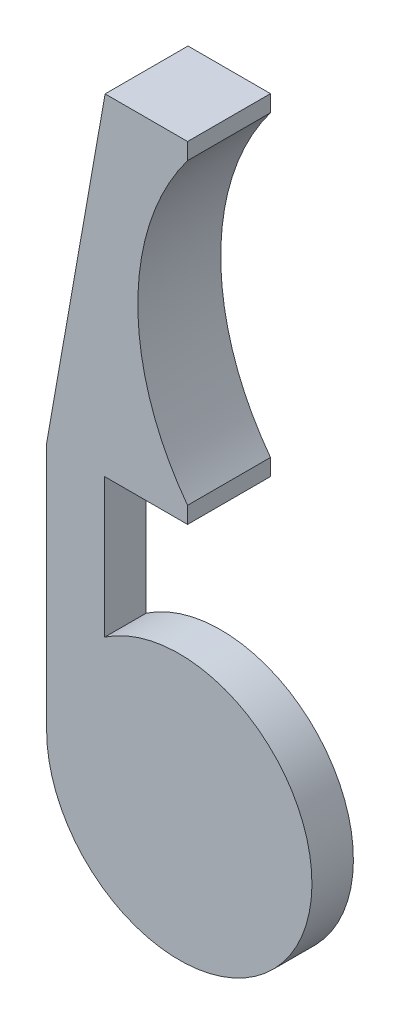
ISO-10303-21;
HEADER;
FILE_DESCRIPTION(('STEP AP214'),'2;1');
FILE_NAME('part.step','',(''),(''),'','','');
FILE_SCHEMA(('AUTOMOTIVE_DESIGN { 1 0 10303 214 1 1 1 1 }'));
ENDSEC;
DATA;
#1=APPLICATION_CONTEXT('core data for automotive mechanical design processes');
#2=APPLICATION_PROTOCOL_DEFINITION('international standard','automotive_design',2000,#1);
#3=PRODUCT_CONTEXT('',#1,'mechanical');
#4=PRODUCT('Part','Part','',(#3));
#5=PRODUCT_RELATED_PRODUCT_CATEGORY('part','',(#4));
#6=PRODUCT_DEFINITION_FORMATION('','',#4);
#7=PRODUCT_DEFINITION_CONTEXT('part definition',#1,'design');
#8=PRODUCT_DEFINITION('design','',#6,#7);
#9=PRODUCT_DEFINITION_SHAPE('','',#8);
#10=(LENGTH_UNIT() NAMED_UNIT(*) SI_UNIT(.MILLI.,.METRE.));
#11=(NAMED_UNIT(*) PLANE_ANGLE_UNIT() SI_UNIT($,.RADIAN.));
#12=(NAMED_UNIT(*) SI_UNIT($,.STERADIAN.) SOLID_ANGLE_UNIT());
#13=UNCERTAINTY_MEASURE_WITH_UNIT(LENGTH_MEASURE(1.E-05),#10,'distance_accuracy_value','');
#14=(GEOMETRIC_REPRESENTATION_CONTEXT(3) GLOBAL_UNCERTAINTY_ASSIGNED_CONTEXT((#13)) GLOBAL_UNIT_ASSIGNED_CONTEXT((#10,
#11,#12)) REPRESENTATION_CONTEXT('',''));
#15=CARTESIAN_POINT('',(0.,0.,0.));
#16=DIRECTION('',(0.,0.,1.));
#17=DIRECTION('',(1.,0.,0.));
#18=AXIS2_PLACEMENT_3D('',#15,#16,#17);
#19=CARTESIAN_POINT('',(0.,0.,6.35));
#20=DIRECTION('',(0.,0.,-1.));
#21=DIRECTION('',(-1.,0.,0.));
#22=AXIS2_PLACEMENT_3D('',#19,#20,#21);
#23=CYLINDRICAL_SURFACE('',#22,20.32);
#24=CARTESIAN_POINT('',(0.,0.,0.));
#25=DIRECTION('',(0.,0.,1.));
#26=DIRECTION('',(1.,0.,0.));
#27=AXIS2_PLACEMENT_3D('',#24,#25,#26);
#28=CIRCLE('',#27,20.32);
#29=CARTESIAN_POINT('',(-20.32,0.,0.));
#30=VERTEX_POINT('',#29);
#31=CARTESIAN_POINT('',(-11.43,16.8005208252602,0.));
#32=VERTEX_POINT('',#31);
#33=EDGE_CURVE('E201',#30,#32,#28,.T.);
#34=ORIENTED_EDGE('',*,*,#33,.T.);
#35=DIRECTION('',(0.,0.,-1.));
#36=VECTOR('',#35,1.);
#37=CARTESIAN_POINT('',(-11.43,16.8005208252602,6.35));
#38=LINE('',#37,#36);
#39=CARTESIAN_POINT('',(-11.43,16.8005208252602,6.35));
#40=VERTEX_POINT('',#39);
#41=EDGE_CURVE('E57',#32,#40,#38,.F.);
#42=ORIENTED_EDGE('',*,*,#41,.T.);
#43=CARTESIAN_POINT('',(0.,0.,6.35));
#44=DIRECTION('',(0.,0.,1.));
#45=DIRECTION('',(1.,0.,0.));
#46=AXIS2_PLACEMENT_3D('',#43,#44,#45);
#47=CIRCLE('',#46,20.32);
#48=CARTESIAN_POINT('',(-20.32,0.,6.35));
#49=VERTEX_POINT('',#48);
#50=EDGE_CURVE('E46',#49,#40,#47,.T.);
#51=ORIENTED_EDGE('',*,*,#50,.F.);
#52=DIRECTION('',(0.,0.,1.));
#53=VECTOR('',#52,1.);
#54=CARTESIAN_POINT('',(-20.32,0.,-39.1234213739034));
#55=LINE('',#54,#53);
#56=EDGE_CURVE('E174',#30,#49,#55,.T.);
#57=ORIENTED_EDGE('',*,*,#56,.F.);
#58=EDGE_LOOP('',(#34,#42,#51,#57));
#59=FACE_BOUND('',#58,.T.);
#60=ADVANCED_FACE('F39',(#59),#23,.T.);
#61=CARTESIAN_POINT('',(0.,0.,6.35));
#62=DIRECTION('',(0.,0.,1.));
#63=DIRECTION('',(1.,0.,0.));
#64=AXIS2_PLACEMENT_3D('',#61,#62,#63);
#65=PLANE('',#64);
#66=ORIENTED_EDGE('',*,*,#50,.T.);
#67=DIRECTION('',(0.,1.,0.));
#68=VECTOR('',#67,1.);
#69=CARTESIAN_POINT('',(-11.43,0.,6.35));
#70=LINE('',#69,#68);
#71=CARTESIAN_POINT('',(-11.43,38.1,6.35));
#72=VERTEX_POINT('',#71);
#73=EDGE_CURVE('E162',#40,#72,#70,.T.);
#74=ORIENTED_EDGE('',*,*,#73,.T.);
#75=DIRECTION('',(1.,0.,0.));
#76=VECTOR('',#75,1.);
#77=CARTESIAN_POINT('',(-11.43,38.1,6.35));
#78=LINE('',#77,#76);
#79=CARTESIAN_POINT('',(1.27,38.1,6.35));
#80=VERTEX_POINT('',#79);
#81=EDGE_CURVE('E147',#72,#80,#78,.T.);
#82=ORIENTED_EDGE('',*,*,#81,.T.);
#83=DIRECTION('',(0.,1.,0.));
#84=VECTOR('',#83,1.);
#85=CARTESIAN_POINT('',(1.27,38.1,6.35));
#86=LINE('',#85,#84);
#87=CARTESIAN_POINT('',(1.27000000000001,40.64,6.35));
#88=VERTEX_POINT('',#87);
#89=EDGE_CURVE('E128',#80,#88,#86,.T.);
#90=ORIENTED_EDGE('',*,*,#89,.T.);
#91=CARTESIAN_POINT('',(31.75,63.5,6.35));
#92=DIRECTION('',(0.,0.,-1.));
#93=DIRECTION('',(-1.,0.,0.));
#94=AXIS2_PLACEMENT_3D('',#91,#92,#93);
#95=CIRCLE('',#94,38.1);
#96=CARTESIAN_POINT('',(1.27,86.36,6.35));
#97=VERTEX_POINT('',#96);
#98=EDGE_CURVE('E150',#88,#97,#95,.T.);
#99=ORIENTED_EDGE('',*,*,#98,.T.);
#100=DIRECTION('',(0.,1.,0.));
#101=VECTOR('',#100,1.);
#102=CARTESIAN_POINT('',(1.27,88.9,6.35));
#103=LINE('',#102,#101);
#104=CARTESIAN_POINT('',(1.27,88.9,6.35));
#105=VERTEX_POINT('',#104);
#106=EDGE_CURVE('E153',#97,#105,#103,.T.);
#107=ORIENTED_EDGE('',*,*,#106,.T.);
#108=DIRECTION('',(-1.,0.,0.));
#109=VECTOR('',#108,1.);
#110=CARTESIAN_POINT('',(-11.3625893800101,88.9,6.35));
#111=LINE('',#110,#109);
#112=CARTESIAN_POINT('',(-11.3625893800101,88.9,6.35));
#113=VERTEX_POINT('',#112);
#114=EDGE_CURVE('E156',#105,#113,#111,.T.);
#115=ORIENTED_EDGE('',*,*,#114,.T.);
#116=DIRECTION('',(-0.173648177666927,-0.984807753012209,0.));
#117=VECTOR('',#116,1.);
#118=CARTESIAN_POINT('',(-20.32,38.1,6.35));
#119=LINE('',#118,#117);
#120=CARTESIAN_POINT('',(-20.32,38.1,6.35));
#121=VERTEX_POINT('',#120);
#122=EDGE_CURVE('E122',#113,#121,#119,.T.);
#123=ORIENTED_EDGE('',*,*,#122,.T.);
#124=DIRECTION('',(0.,-1.,0.));
#125=VECTOR('',#124,1.);
#126=CARTESIAN_POINT('',(-20.32,0.,6.35));
#127=LINE('',#126,#125);
#128=EDGE_CURVE('E180',#121,#49,#127,.T.);
#129=ORIENTED_EDGE('',*,*,#128,.T.);
#130=EDGE_LOOP('',(#66,#74,#82,#90,#99,#107,#115,#123,#129));
#131=FACE_BOUND('',#130,.T.);
#132=ADVANCED_FACE('F224',(#131),#65,.T.);
#133=CARTESIAN_POINT('',(0.,0.,0.));
#134=DIRECTION('',(0.,0.,1.));
#135=DIRECTION('',(1.,0.,0.));
#136=AXIS2_PLACEMENT_3D('',#133,#134,#135);
#137=PLANE('',#136);
#138=ORIENTED_EDGE('',*,*,#33,.F.);
#139=DIRECTION('',(0.,1.,0.));
#140=VECTOR('',#139,1.);
#141=CARTESIAN_POINT('',(-20.32,0.,0.));
#142=LINE('',#141,#140);
#143=CARTESIAN_POINT('',(-20.32,38.1,0.));
#144=VERTEX_POINT('',#143);
#145=EDGE_CURVE('E170',#30,#144,#142,.T.);
#146=ORIENTED_EDGE('',*,*,#145,.T.);
#147=DIRECTION('',(1.,0.,0.));
#148=VECTOR('',#147,1.);
#149=CARTESIAN_POINT('',(-11.43,38.1,0.));
#150=LINE('',#149,#148);
#151=CARTESIAN_POINT('',(-11.43,38.1,0.));
#152=VERTEX_POINT('',#151);
#153=EDGE_CURVE('E177',#144,#152,#150,.T.);
#154=ORIENTED_EDGE('',*,*,#153,.T.);
#155=DIRECTION('',(0.,-1.,0.));
#156=VECTOR('',#155,1.);
#157=CARTESIAN_POINT('',(-11.43,0.,0.));
#158=LINE('',#157,#156);
#159=EDGE_CURVE('E173',#152,#32,#158,.T.);
#160=ORIENTED_EDGE('',*,*,#159,.T.);
#161=EDGE_LOOP('',(#138,#146,#154,#160));
#162=FACE_BOUND('',#161,.T.);
#163=CARTESIAN_POINT('',(0.,0.,0.));
#164=DIRECTION('',(0.,0.,1.));
#165=DIRECTION('',(1.,0.,0.));
#166=AXIS2_PLACEMENT_3D('',#163,#164,#165);
#167=CIRCLE('',#166,4.445);
#168=CARTESIAN_POINT('',(4.445,0.,0.));
#169=VERTEX_POINT('',#168);
#170=EDGE_CURVE('E11',#169,#169,#167,.F.);
#171=ORIENTED_EDGE('',*,*,#170,.F.);
#172=EDGE_LOOP('',(#171));
#173=FACE_BOUND('',#172,.T.);
#174=ADVANCED_FACE('F208',(#162,#173),#137,.F.);
#175=CARTESIAN_POINT('',(0.,0.,-2.54));
#176=DIRECTION('',(0.,0.,-1.));
#177=DIRECTION('',(-1.,0.,0.));
#178=AXIS2_PLACEMENT_3D('',#175,#176,#177);
#179=PLANE('',#178);
#180=CARTESIAN_POINT('',(0.,0.,-2.54));
#181=DIRECTION('',(0.,0.,-1.));
#182=DIRECTION('',(-1.,0.,0.));
#183=AXIS2_PLACEMENT_3D('',#180,#181,#182);
#184=CIRCLE('',#183,4.445);
#185=CARTESIAN_POINT('',(-4.445,0.,-2.54));
#186=VERTEX_POINT('',#185);
#187=EDGE_CURVE('E196',#186,#186,#184,.T.);
#188=ORIENTED_EDGE('',*,*,#187,.T.);
#189=EDGE_LOOP('',(#188));
#190=FACE_BOUND('',#189,.T.);
#191=CARTESIAN_POINT('',(0.,0.,-2.54));
#192=DIRECTION('',(0.,0.,-1.));
#193=DIRECTION('',(-1.,0.,0.));
#194=AXIS2_PLACEMENT_3D('',#191,#192,#193);
#195=CIRCLE('',#194,3.175);
#196=CARTESIAN_POINT('',(-3.175,0.,-2.54));
#197=VERTEX_POINT('',#196);
#198=EDGE_CURVE('E193',#197,#197,#195,.T.);
#199=ORIENTED_EDGE('',*,*,#198,.F.);
#200=EDGE_LOOP('',(#199));
#201=FACE_BOUND('',#200,.T.);
#202=ADVANCED_FACE('F246',(#190,#201),#179,.T.);
#203=CARTESIAN_POINT('',(0.,0.,-2.54));
#204=DIRECTION('',(0.,0.,1.));
#205=DIRECTION('',(1.,0.,0.));
#206=AXIS2_PLACEMENT_3D('',#203,#204,#205);
#207=CYLINDRICAL_SURFACE('',#206,4.445);
#208=ORIENTED_EDGE('',*,*,#187,.F.);
#209=EDGE_LOOP('',(#208));
#210=FACE_BOUND('',#209,.T.);
#211=ORIENTED_EDGE('',*,*,#170,.T.);
#212=EDGE_LOOP('',(#211));
#213=FACE_BOUND('',#212,.T.);
#214=ADVANCED_FACE('F248',(#210,#213),#207,.T.);
#215=CARTESIAN_POINT('',(0.,0.,-2.54));
#216=DIRECTION('',(0.,0.,1.));
#217=DIRECTION('',(1.,0.,0.));
#218=AXIS2_PLACEMENT_3D('',#215,#216,#217);
#219=CYLINDRICAL_SURFACE('',#218,3.175);
#220=ORIENTED_EDGE('',*,*,#198,.T.);
#221=EDGE_LOOP('',(#220));
#222=FACE_BOUND('',#221,.T.);
#223=CARTESIAN_POINT('',(0.,0.,0.));
#224=DIRECTION('',(0.,0.,-1.));
#225=DIRECTION('',(-1.,0.,0.));
#226=AXIS2_PLACEMENT_3D('',#223,#224,#225);
#227=CIRCLE('',#226,3.175);
#228=CARTESIAN_POINT('',(-3.175,0.,0.));
#229=VERTEX_POINT('',#228);
#230=EDGE_CURVE('E192',#229,#229,#227,.T.);
#231=ORIENTED_EDGE('',*,*,#230,.F.);
#232=EDGE_LOOP('',(#231));
#233=FACE_BOUND('',#232,.T.);
#234=ADVANCED_FACE('F251',(#222,#233),#219,.F.);
#235=ORIENTED_EDGE('',*,*,#230,.T.);
#236=EDGE_LOOP('',(#235));
#237=FACE_BOUND('',#236,.T.);
#238=ADVANCED_FACE('F235',(#237),#137,.F.);
#239=CARTESIAN_POINT('',(-11.43,0.,-39.1234213739034));
#240=DIRECTION('',(1.,0.,0.));
#241=DIRECTION('',(0.,0.,-1.));
#242=AXIS2_PLACEMENT_3D('',#239,#240,#241);
#243=PLANE('',#242);
#244=ORIENTED_EDGE('',*,*,#41,.F.);
#245=ORIENTED_EDGE('',*,*,#159,.F.);
#246=DIRECTION('',(0.,0.,1.));
#247=VECTOR('',#246,1.);
#248=CARTESIAN_POINT('',(-11.43,38.1,-39.1234213739034));
#249=LINE('',#248,#247);
#250=EDGE_CURVE('E183',#152,#72,#249,.T.);
#251=ORIENTED_EDGE('',*,*,#250,.T.);
#252=ORIENTED_EDGE('',*,*,#73,.F.);
#253=EDGE_LOOP('',(#244,#245,#251,#252));
#254=FACE_BOUND('',#253,.T.);
#255=ADVANCED_FACE('F207',(#254),#243,.T.);
#256=CARTESIAN_POINT('',(-20.32,0.,-39.1234213739034));
#257=DIRECTION('',(-1.,0.,0.));
#258=DIRECTION('',(0.,0.,1.));
#259=AXIS2_PLACEMENT_3D('',#256,#257,#258);
#260=PLANE('',#259);
#261=ORIENTED_EDGE('',*,*,#145,.F.);
#262=ORIENTED_EDGE('',*,*,#56,.T.);
#263=ORIENTED_EDGE('',*,*,#128,.F.);
#264=DIRECTION('',(0.,0.,1.));
#265=VECTOR('',#264,1.);
#266=CARTESIAN_POINT('',(-20.32,38.1,-39.1234213739034));
#267=LINE('',#266,#265);
#268=EDGE_CURVE('E185',#144,#121,#267,.T.);
#269=ORIENTED_EDGE('',*,*,#268,.F.);
#270=EDGE_LOOP('',(#261,#262,#263,#269));
#271=FACE_BOUND('',#270,.T.);
#272=ADVANCED_FACE('F227',(#271),#260,.T.);
#273=CARTESIAN_POINT('',(-11.43,38.1,-6.35));
#274=DIRECTION('',(0.,-1.,0.));
#275=DIRECTION('',(0.,0.,-1.));
#276=AXIS2_PLACEMENT_3D('',#273,#274,#275);
#277=PLANE('',#276);
#278=ORIENTED_EDGE('',*,*,#153,.F.);
#279=DIRECTION('',(0.,0.,1.));
#280=VECTOR('',#279,1.);
#281=CARTESIAN_POINT('',(-20.32,38.1,-6.35));
#282=LINE('',#281,#280);
#283=CARTESIAN_POINT('',(-20.32,38.1,-6.35));
#284=VERTEX_POINT('',#283);
#285=EDGE_CURVE('E116',#284,#144,#282,.T.);
#286=ORIENTED_EDGE('',*,*,#285,.F.);
#287=DIRECTION('',(1.,0.,0.));
#288=VECTOR('',#287,1.);
#289=CARTESIAN_POINT('',(-20.32,38.1,-6.35));
#290=LINE('',#289,#288);
#291=CARTESIAN_POINT('',(1.27,38.1,-6.35));
#292=VERTEX_POINT('',#291);
#293=EDGE_CURVE('E110',#284,#292,#290,.T.);
#294=ORIENTED_EDGE('',*,*,#293,.T.);
#295=DIRECTION('',(0.,0.,1.));
#296=VECTOR('',#295,1.);
#297=CARTESIAN_POINT('',(1.27,38.1,-6.35));
#298=LINE('',#297,#296);
#299=EDGE_CURVE('E113',#292,#80,#298,.T.);
#300=ORIENTED_EDGE('',*,*,#299,.T.);
#301=ORIENTED_EDGE('',*,*,#81,.F.);
#302=ORIENTED_EDGE('',*,*,#250,.F.);
#303=EDGE_LOOP('',(#278,#286,#294,#300,#301,#302));
#304=FACE_BOUND('',#303,.T.);
#305=ADVANCED_FACE('F112',(#304),#277,.T.);
#306=CARTESIAN_POINT('',(-20.32,38.1,-6.35));
#307=DIRECTION('',(-0.984807753012209,0.173648177666927,0.));
#308=DIRECTION('',(-0.173648177666927,-0.984807753012209,0.));
#309=AXIS2_PLACEMENT_3D('',#306,#307,#308);
#310=PLANE('',#309);
#311=ORIENTED_EDGE('',*,*,#122,.F.);
#312=DIRECTION('',(0.,0.,1.));
#313=VECTOR('',#312,1.);
#314=CARTESIAN_POINT('',(-11.3625893800101,88.9,-6.35));
#315=LINE('',#314,#313);
#316=CARTESIAN_POINT('',(-11.3625893800101,88.9,-6.35));
#317=VERTEX_POINT('',#316);
#318=EDGE_CURVE('E163',#317,#113,#315,.T.);
#319=ORIENTED_EDGE('',*,*,#318,.F.);
#320=DIRECTION('',(-0.173648177666927,-0.984807753012209,0.));
#321=VECTOR('',#320,1.);
#322=CARTESIAN_POINT('',(-20.32,38.1,-6.35));
#323=LINE('',#322,#321);
#324=EDGE_CURVE('E130',#317,#284,#323,.T.);
#325=ORIENTED_EDGE('',*,*,#324,.T.);
#326=ORIENTED_EDGE('',*,*,#285,.T.);
#327=ORIENTED_EDGE('',*,*,#268,.T.);
#328=EDGE_LOOP('',(#311,#319,#325,#326,#327));
#329=FACE_BOUND('',#328,.T.);
#330=ADVANCED_FACE('F213',(#329),#310,.T.);
#331=CARTESIAN_POINT('',(-11.3625893800101,88.9,-6.35));
#332=DIRECTION('',(0.,1.,0.));
#333=DIRECTION('',(0.,0.,1.));
#334=AXIS2_PLACEMENT_3D('',#331,#332,#333);
#335=PLANE('',#334);
#336=ORIENTED_EDGE('',*,*,#114,.F.);
#337=DIRECTION('',(0.,0.,1.));
#338=VECTOR('',#337,1.);
#339=CARTESIAN_POINT('',(1.27,88.9,-6.35));
#340=LINE('',#339,#338);
#341=CARTESIAN_POINT('',(1.27,88.9,-6.35));
#342=VERTEX_POINT('',#341);
#343=EDGE_CURVE('E165',#342,#105,#340,.T.);
#344=ORIENTED_EDGE('',*,*,#343,.F.);
#345=DIRECTION('',(-1.,0.,0.));
#346=VECTOR('',#345,1.);
#347=CARTESIAN_POINT('',(-11.3625893800101,88.9,-6.35));
#348=LINE('',#347,#346);
#349=EDGE_CURVE('E143',#342,#317,#348,.T.);
#350=ORIENTED_EDGE('',*,*,#349,.T.);
#351=ORIENTED_EDGE('',*,*,#318,.T.);
#352=EDGE_LOOP('',(#336,#344,#350,#351));
#353=FACE_BOUND('',#352,.T.);
#354=ADVANCED_FACE('F311',(#353),#335,.T.);
#355=CARTESIAN_POINT('',(1.27,88.9,-6.35));
#356=DIRECTION('',(1.,0.,0.));
#357=DIRECTION('',(0.,1.,0.));
#358=AXIS2_PLACEMENT_3D('',#355,#356,#357);
#359=PLANE('',#358);
#360=ORIENTED_EDGE('',*,*,#106,.F.);
#361=DIRECTION('',(0.,0.,1.));
#362=VECTOR('',#361,1.);
#363=CARTESIAN_POINT('',(1.27,86.36,-6.35));
#364=LINE('',#363,#362);
#365=CARTESIAN_POINT('',(1.27,86.36,-6.35));
#366=VERTEX_POINT('',#365);
#367=EDGE_CURVE('E167',#366,#97,#364,.T.);
#368=ORIENTED_EDGE('',*,*,#367,.F.);
#369=DIRECTION('',(0.,1.,0.));
#370=VECTOR('',#369,1.);
#371=CARTESIAN_POINT('',(1.27,88.9,-6.35));
#372=LINE('',#371,#370);
#373=EDGE_CURVE('E138',#366,#342,#372,.T.);
#374=ORIENTED_EDGE('',*,*,#373,.T.);
#375=ORIENTED_EDGE('',*,*,#343,.T.);
#376=EDGE_LOOP('',(#360,#368,#374,#375));
#377=FACE_BOUND('',#376,.T.);
#378=ADVANCED_FACE('F218',(#377),#359,.T.);
#379=CARTESIAN_POINT('',(31.75,63.5,-6.35));
#380=DIRECTION('',(0.,0.,1.));
#381=DIRECTION('',(1.,0.,0.));
#382=AXIS2_PLACEMENT_3D('',#379,#380,#381);
#383=CYLINDRICAL_SURFACE('',#382,38.1);
#384=ORIENTED_EDGE('',*,*,#98,.F.);
#385=DIRECTION('',(0.,0.,1.));
#386=VECTOR('',#385,1.);
#387=CARTESIAN_POINT('',(1.27000000000001,40.64,-6.35));
#388=LINE('',#387,#386);
#389=CARTESIAN_POINT('',(1.27000000000001,40.64,-6.35));
#390=VERTEX_POINT('',#389);
#391=EDGE_CURVE('E129',#390,#88,#388,.T.);
#392=ORIENTED_EDGE('',*,*,#391,.F.);
#393=CARTESIAN_POINT('',(31.75,63.5,-6.35));
#394=DIRECTION('',(0.,0.,-1.));
#395=DIRECTION('',(-1.,0.,0.));
#396=AXIS2_PLACEMENT_3D('',#393,#394,#395);
#397=CIRCLE('',#396,38.1);
#398=EDGE_CURVE('E136',#390,#366,#397,.T.);
#399=ORIENTED_EDGE('',*,*,#398,.T.);
#400=ORIENTED_EDGE('',*,*,#367,.T.);
#401=EDGE_LOOP('',(#384,#392,#399,#400));
#402=FACE_BOUND('',#401,.T.);
#403=ADVANCED_FACE('F222',(#402),#383,.F.);
#404=CARTESIAN_POINT('',(1.27,38.1,-6.35));
#405=DIRECTION('',(1.,0.,0.));
#406=DIRECTION('',(0.,0.,-1.));
#407=AXIS2_PLACEMENT_3D('',#404,#405,#406);
#408=PLANE('',#407);
#409=ORIENTED_EDGE('',*,*,#89,.F.);
#410=ORIENTED_EDGE('',*,*,#299,.F.);
#411=DIRECTION('',(0.,1.,0.));
#412=VECTOR('',#411,1.);
#413=CARTESIAN_POINT('',(1.27,38.1,-6.35));
#414=LINE('',#413,#412);
#415=EDGE_CURVE('E121',#292,#390,#414,.T.);
#416=ORIENTED_EDGE('',*,*,#415,.T.);
#417=ORIENTED_EDGE('',*,*,#391,.T.);
#418=EDGE_LOOP('',(#409,#410,#416,#417));
#419=FACE_BOUND('',#418,.T.);
#420=ADVANCED_FACE('F126',(#419),#408,.T.);
#421=CARTESIAN_POINT('',(31.75,63.5,-6.35));
#422=DIRECTION('',(0.,0.,-1.));
#423=DIRECTION('',(-1.,0.,0.));
#424=AXIS2_PLACEMENT_3D('',#421,#422,#423);
#425=PLANE('',#424);
#426=ORIENTED_EDGE('',*,*,#293,.F.);
#427=ORIENTED_EDGE('',*,*,#324,.F.);
#428=ORIENTED_EDGE('',*,*,#349,.F.);
#429=ORIENTED_EDGE('',*,*,#373,.F.);
#430=ORIENTED_EDGE('',*,*,#398,.F.);
#431=ORIENTED_EDGE('',*,*,#415,.F.);
#432=EDGE_LOOP('',(#426,#427,#428,#429,#430,#431));
#433=FACE_BOUND('',#432,.T.);
#434=ADVANCED_FACE('F133',(#433),#425,.T.);
#435=CLOSED_SHELL('',(#60,#132,#174,#202,#214,#234,#238,#255,#272,#305,#330,#354,#378,#403,#420,#434));
#436=MANIFOLD_SOLID_BREP('B2',#435);
#437=ADVANCED_BREP_SHAPE_REPRESENTATION('',(#18,#436),#14);
#438=SHAPE_DEFINITION_REPRESENTATION(#9,#437);
ENDSEC;
END-ISO-10303-21;
